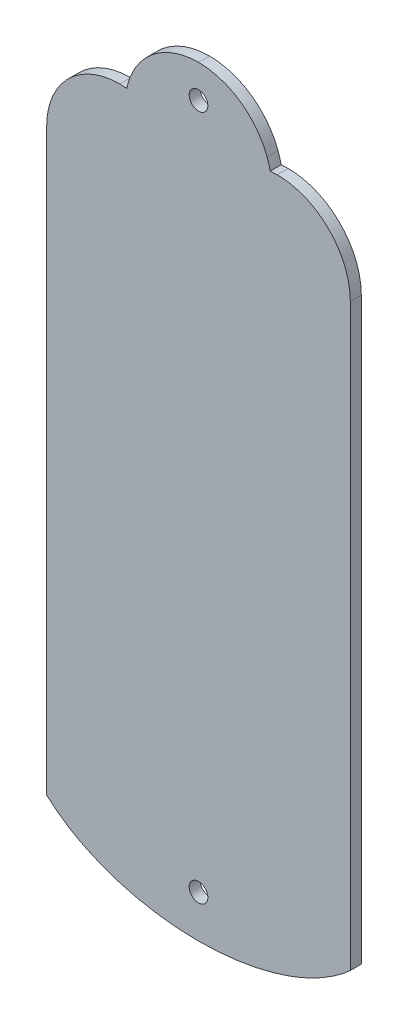
ISO-10303-21;
HEADER;
FILE_DESCRIPTION(('STEP AP214'),'2;1');
FILE_NAME('part.step','',(''),(''),'','','');
FILE_SCHEMA(('AUTOMOTIVE_DESIGN { 1 0 10303 214 1 1 1 1 }'));
ENDSEC;
DATA;
#1=APPLICATION_CONTEXT('core data for automotive mechanical design processes');
#2=APPLICATION_PROTOCOL_DEFINITION('international standard','automotive_design',2000,#1);
#3=PRODUCT_CONTEXT('',#1,'mechanical');
#4=PRODUCT('Part','Part','',(#3));
#5=PRODUCT_RELATED_PRODUCT_CATEGORY('part','',(#4));
#6=PRODUCT_DEFINITION_FORMATION('','',#4);
#7=PRODUCT_DEFINITION_CONTEXT('part definition',#1,'design');
#8=PRODUCT_DEFINITION('design','',#6,#7);
#9=PRODUCT_DEFINITION_SHAPE('','',#8);
#10=(LENGTH_UNIT() NAMED_UNIT(*) SI_UNIT(.MILLI.,.METRE.));
#11=(NAMED_UNIT(*) PLANE_ANGLE_UNIT() SI_UNIT($,.RADIAN.));
#12=(NAMED_UNIT(*) SI_UNIT($,.STERADIAN.) SOLID_ANGLE_UNIT());
#13=UNCERTAINTY_MEASURE_WITH_UNIT(LENGTH_MEASURE(1.E-05),#10,'distance_accuracy_value','');
#14=(GEOMETRIC_REPRESENTATION_CONTEXT(3) GLOBAL_UNCERTAINTY_ASSIGNED_CONTEXT((#13)) GLOBAL_UNIT_ASSIGNED_CONTEXT((#10,
#11,#12)) REPRESENTATION_CONTEXT('',''));
#15=CARTESIAN_POINT('',(0.,0.,0.));
#16=DIRECTION('',(0.,0.,1.));
#17=DIRECTION('',(1.,0.,0.));
#18=AXIS2_PLACEMENT_3D('',#15,#16,#17);
#19=CARTESIAN_POINT('',(35.6433481551177,82.2823295175627,3.));
#20=DIRECTION('',(0.,0.,-1.));
#21=DIRECTION('',(-1.,0.,0.));
#22=AXIS2_PLACEMENT_3D('',#19,#20,#21);
#23=PLANE('',#22);
#24=CARTESIAN_POINT('',(41.5007829350458,68.1407912189944,3.));
#25=CARTESIAN_POINT('',(41.5007829350458,79.1862625771814,3.));
#26=CARTESIAN_POINT('',(32.5472812147364,88.1397642974907,3.));
#27=CARTESIAN_POINT('',(21.5018098565495,88.1397642974907,3.));
#28=B_SPLINE_CURVE_WITH_KNOTS('',3,(#24,#25,#26,#27),.UNSPECIFIED.,.F.,.F.,(4,4),(0.,1.),.UNSPECIFIED.);
#29=CARTESIAN_POINT('',(41.5007829350458,68.1407912189944,3.));
#30=VERTEX_POINT('',#29);
#31=CARTESIAN_POINT('',(21.5018098565495,88.1397642974907,3.));
#32=VERTEX_POINT('',#31);
#33=EDGE_CURVE('E283',#30,#32,#28,.T.);
#34=ORIENTED_EDGE('',*,*,#33,.T.);
#35=CARTESIAN_POINT('',(21.5018098565495,88.1397642974907,3.));
#36=CARTESIAN_POINT('',(20.8597517173328,88.1397642974907,3.));
#37=CARTESIAN_POINT('',(20.2212248009885,88.1080263553329,3.));
#38=CARTESIAN_POINT('',(19.5932700214146,88.0480386301959,3.));
#39=B_SPLINE_CURVE_WITH_KNOTS('',3,(#35,#36,#37,#38),.UNSPECIFIED.,.F.,.F.,(4,4),(1.,2.),.UNSPECIFIED.);
#40=CARTESIAN_POINT('',(19.5932700214146,88.0480386301959,3.));
#41=VERTEX_POINT('',#40);
#42=EDGE_CURVE('E118',#32,#41,#39,.T.);
#43=ORIENTED_EDGE('',*,*,#42,.T.);
#44=CARTESIAN_POINT('',(19.5932700214146,88.0480386301959,3.));
#45=CARTESIAN_POINT('',(19.3886744132843,89.0464057699746,3.));
#46=CARTESIAN_POINT('',(19.1064349656552,90.0200758814933,3.));
#47=CARTESIAN_POINT('',(18.7607196337104,90.9619865190074,3.));
#48=B_SPLINE_CURVE_WITH_KNOTS('',3,(#44,#45,#46,#47),.UNSPECIFIED.,.F.,.F.,(4,4),(2.,3.),.UNSPECIFIED.);
#49=CARTESIAN_POINT('',(18.7607196337104,90.9619865190074,3.));
#50=VERTEX_POINT('',#49);
#51=EDGE_CURVE('E263',#41,#50,#48,.T.);
#52=ORIENTED_EDGE('',*,*,#51,.T.);
#53=CARTESIAN_POINT('',(18.7607196337104,90.9619865190074,3.));
#54=CARTESIAN_POINT('',(15.9384974121937,98.5819994362105,3.));
#55=CARTESIAN_POINT('',(8.60425516549215,104.014764293522,3.));
#56=CARTESIAN_POINT('',(0.,104.014764293522,3.));
#57=B_SPLINE_CURVE_WITH_KNOTS('',3,(#53,#54,#55,#56),.UNSPECIFIED.,.F.,.F.,(4,4),(3.,4.),.UNSPECIFIED.);
#58=CARTESIAN_POINT('',(0.,104.014764293522,3.));
#59=VERTEX_POINT('',#58);
#60=EDGE_CURVE('E255',#50,#59,#57,.T.);
#61=ORIENTED_EDGE('',*,*,#60,.T.);
#62=CARTESIAN_POINT('',(0.,104.014764293522,3.));
#63=CARTESIAN_POINT('',(-8.60425516549218,104.014764293522,3.));
#64=CARTESIAN_POINT('',(-15.9384974121938,98.5819994362105,3.));
#65=CARTESIAN_POINT('',(-18.7607196337104,90.9619865190074,3.));
#66=B_SPLINE_CURVE_WITH_KNOTS('',3,(#62,#63,#64,#65),.UNSPECIFIED.,.F.,.F.,(4,4),(4.,5.),.UNSPECIFIED.);
#67=CARTESIAN_POINT('',(-18.7607196337104,90.9619865190074,3.));
#68=VERTEX_POINT('',#67);
#69=EDGE_CURVE('E247',#59,#68,#66,.T.);
#70=ORIENTED_EDGE('',*,*,#69,.T.);
#71=CARTESIAN_POINT('',(-18.7607196337104,90.9619865190074,3.));
#72=CARTESIAN_POINT('',(-19.106456497502,90.0200758814933,3.));
#73=CARTESIAN_POINT('',(-19.3886744132843,89.0464057699746,3.));
#74=CARTESIAN_POINT('',(-19.5932700214146,88.0480386301959,3.));
#75=B_SPLINE_CURVE_WITH_KNOTS('',3,(#71,#72,#73,#74),.UNSPECIFIED.,.F.,.F.,(4,4),(5.,6.),.UNSPECIFIED.);
#76=CARTESIAN_POINT('',(-19.5932700214146,88.0480386301959,3.));
#77=VERTEX_POINT('',#76);
#78=EDGE_CURVE('E243',#68,#77,#75,.T.);
#79=ORIENTED_EDGE('',*,*,#78,.T.);
#80=CARTESIAN_POINT('',(-19.5932700214146,88.0480386301959,3.));
#81=CARTESIAN_POINT('',(-20.2212248009885,88.1080263553329,3.));
#82=CARTESIAN_POINT('',(-20.8562204944604,88.1397642974907,3.));
#83=CARTESIAN_POINT('',(-21.4982786336771,88.1397642974907,3.));
#84=B_SPLINE_CURVE_WITH_KNOTS('',3,(#80,#81,#82,#83),.UNSPECIFIED.,.F.,.F.,(4,4),(6.,7.),.UNSPECIFIED.);
#85=CARTESIAN_POINT('',(-21.4982786336771,88.1397642974907,3.));
#86=VERTEX_POINT('',#85);
#87=EDGE_CURVE('E218',#77,#86,#84,.T.);
#88=ORIENTED_EDGE('',*,*,#87,.T.);
#89=CARTESIAN_POINT('',(-21.4982786336771,88.1397642974907,3.));
#90=CARTESIAN_POINT('',(-32.5472812147365,88.1397642974907,3.));
#91=CARTESIAN_POINT('',(-41.5007829350458,79.1862625771814,3.));
#92=CARTESIAN_POINT('',(-41.5007829350458,68.1407912189944,3.));
#93=B_SPLINE_CURVE_WITH_KNOTS('',3,(#89,#90,#91,#92),.UNSPECIFIED.,.F.,.F.,(4,4),(7.,8.),.UNSPECIFIED.);
#94=CARTESIAN_POINT('',(-41.5007829350458,68.1407912189944,3.));
#95=VERTEX_POINT('',#94);
#96=EDGE_CURVE('E213',#86,#95,#93,.T.);
#97=ORIENTED_EDGE('',*,*,#96,.T.);
#98=DIRECTION('',(0.,-1.,0.));
#99=VECTOR('',#98,1.);
#100=CARTESIAN_POINT('',(-41.5007829350458,68.1407912189944,3.));
#101=LINE('',#100,#99);
#102=CARTESIAN_POINT('',(-41.5007829350458,-90.2458372950111,3.));
#103=VERTEX_POINT('',#102);
#104=EDGE_CURVE('E208',#95,#103,#101,.T.);
#105=ORIENTED_EDGE('',*,*,#104,.T.);
#106=CARTESIAN_POINT('',(-41.5007829350458,-90.2458372950111,3.));
#107=CARTESIAN_POINT('',(-38.3892803520021,-93.0892253219153,3.));
#108=CARTESIAN_POINT('',(-34.5686909907068,-95.5939604626194,3.));
#109=CARTESIAN_POINT('',(-30.1977691574896,-97.6647642951095,3.));
#110=B_SPLINE_CURVE_WITH_KNOTS('',3,(#106,#107,#108,#109),.UNSPECIFIED.,.F.,.F.,(4,4),(11.,12.),.UNSPECIFIED.);
#111=CARTESIAN_POINT('',(-30.1977691574896,-97.6647642951095,3.));
#112=VERTEX_POINT('',#111);
#113=EDGE_CURVE('E200',#103,#112,#110,.T.);
#114=ORIENTED_EDGE('',*,*,#113,.T.);
#115=CARTESIAN_POINT('',(-30.1977691574896,-97.6647642951095,3.));
#116=CARTESIAN_POINT('',(-21.7804965494594,-101.654680099505,3.));
#117=CARTESIAN_POINT('',(-11.3241580510969,-104.014764293522,3.));
#118=CARTESIAN_POINT('',(0.,-104.014764293522,3.));
#119=B_SPLINE_CURVE_WITH_KNOTS('',3,(#115,#116,#117,#118),.UNSPECIFIED.,.F.,.F.,(4,4),(12.,13.),.UNSPECIFIED.);
#120=CARTESIAN_POINT('',(0.,-104.014764293522,3.));
#121=VERTEX_POINT('',#120);
#122=EDGE_CURVE('E155',#112,#121,#119,.T.);
#123=ORIENTED_EDGE('',*,*,#122,.T.);
#124=CARTESIAN_POINT('',(0.,-104.014764293522,3.));
#125=CARTESIAN_POINT('',(11.3241580510969,-104.014764293522,3.));
#126=CARTESIAN_POINT('',(21.7804965494594,-101.654680099505,3.));
#127=CARTESIAN_POINT('',(30.1977691574896,-97.6647642951095,3.));
#128=B_SPLINE_CURVE_WITH_KNOTS('',3,(#124,#125,#126,#127),.UNSPECIFIED.,.F.,.F.,(4,4),(13.,14.),.UNSPECIFIED.);
#129=CARTESIAN_POINT('',(30.1977691574896,-97.6647642951095,3.));
#130=VERTEX_POINT('',#129);
#131=EDGE_CURVE('E149',#121,#130,#128,.T.);
#132=ORIENTED_EDGE('',*,*,#131,.T.);
#133=CARTESIAN_POINT('',(30.1977691574896,-97.6647642951095,3.));
#134=CARTESIAN_POINT('',(34.5686909907068,-95.5939604626194,3.));
#135=CARTESIAN_POINT('',(38.3892803520021,-93.0892253219153,3.));
#136=CARTESIAN_POINT('',(41.5007829350458,-90.2458372950111,3.));
#137=B_SPLINE_CURVE_WITH_KNOTS('',3,(#133,#134,#135,#136),.UNSPECIFIED.,.F.,.F.,(4,4),(14.,15.),.UNSPECIFIED.);
#138=CARTESIAN_POINT('',(41.5007829350458,-90.2458372950111,3.));
#139=VERTEX_POINT('',#138);
#140=EDGE_CURVE('E153',#130,#139,#137,.T.);
#141=ORIENTED_EDGE('',*,*,#140,.T.);
#142=DIRECTION('',(0.,1.,0.));
#143=VECTOR('',#142,1.);
#144=CARTESIAN_POINT('',(41.5007829350458,68.1407912189944,3.));
#145=LINE('',#144,#143);
#146=EDGE_CURVE('E57',#139,#30,#145,.T.);
#147=ORIENTED_EDGE('',*,*,#146,.T.);
#148=EDGE_LOOP('',(#34,#43,#52,#61,#70,#79,#88,#97,#105,#114,#123,#132,#141,#147));
#149=FACE_BOUND('',#148,.T.);
#150=CARTESIAN_POINT('',(0.,95.,3.));
#151=DIRECTION('',(0.,0.,1.));
#152=DIRECTION('',(1.,0.,0.));
#153=AXIS2_PLACEMENT_3D('',#150,#151,#152);
#154=CIRCLE('',#153,2.55);
#155=CARTESIAN_POINT('',(2.55,95.,3.));
#156=VERTEX_POINT('',#155);
#157=EDGE_CURVE('E297',#156,#156,#154,.T.);
#158=ORIENTED_EDGE('',*,*,#157,.F.);
#159=EDGE_LOOP('',(#158));
#160=FACE_BOUND('',#159,.T.);
#161=CARTESIAN_POINT('',(0.,-92.443657491673,3.));
#162=DIRECTION('',(0.,0.,1.));
#163=DIRECTION('',(1.,0.,0.));
#164=AXIS2_PLACEMENT_3D('',#161,#162,#163);
#165=CIRCLE('',#164,2.55);
#166=CARTESIAN_POINT('',(2.55,-92.443657491673,3.));
#167=VERTEX_POINT('',#166);
#168=EDGE_CURVE('E298',#167,#167,#165,.T.);
#169=ORIENTED_EDGE('',*,*,#168,.F.);
#170=EDGE_LOOP('',(#169));
#171=FACE_BOUND('',#170,.T.);
#172=ADVANCED_FACE('F39',(#149,#160,#171),#23,.F.);
#173=CARTESIAN_POINT('',(35.6433481551177,82.2823295175627,0.));
#174=DIRECTION('',(0.,0.,-1.));
#175=DIRECTION('',(-1.,0.,0.));
#176=AXIS2_PLACEMENT_3D('',#173,#174,#175);
#177=PLANE('',#176);
#178=CARTESIAN_POINT('',(0.,95.,0.));
#179=DIRECTION('',(0.,0.,1.));
#180=DIRECTION('',(1.,0.,0.));
#181=AXIS2_PLACEMENT_3D('',#178,#179,#180);
#182=CIRCLE('',#181,2.55);
#183=CARTESIAN_POINT('',(2.55,95.,0.));
#184=VERTEX_POINT('',#183);
#185=EDGE_CURVE('E291',#184,#184,#182,.T.);
#186=ORIENTED_EDGE('',*,*,#185,.T.);
#187=EDGE_LOOP('',(#186));
#188=FACE_BOUND('',#187,.T.);
#189=CARTESIAN_POINT('',(41.5007829350458,68.1407912189944,0.));
#190=CARTESIAN_POINT('',(41.5007829350458,79.1862625771814,0.));
#191=CARTESIAN_POINT('',(32.5472812147364,88.1397642974907,0.));
#192=CARTESIAN_POINT('',(21.5018098565495,88.1397642974907,0.));
#193=B_SPLINE_CURVE_WITH_KNOTS('',3,(#189,#190,#191,#192),.UNSPECIFIED.,.F.,.F.,(4,4),(0.,1.),.UNSPECIFIED.);
#194=CARTESIAN_POINT('',(41.5007829350458,68.1407912189944,0.));
#195=VERTEX_POINT('',#194);
#196=CARTESIAN_POINT('',(21.5018098565495,88.1397642974907,0.));
#197=VERTEX_POINT('',#196);
#198=EDGE_CURVE('E301',#195,#197,#193,.T.);
#199=ORIENTED_EDGE('',*,*,#198,.F.);
#200=DIRECTION('',(0.,1.,0.));
#201=VECTOR('',#200,1.);
#202=CARTESIAN_POINT('',(41.5007829350458,68.1407912189944,0.));
#203=LINE('',#202,#201);
#204=CARTESIAN_POINT('',(41.5007829350458,-90.2458372950111,0.));
#205=VERTEX_POINT('',#204);
#206=EDGE_CURVE('E110',#205,#195,#203,.T.);
#207=ORIENTED_EDGE('',*,*,#206,.F.);
#208=CARTESIAN_POINT('',(30.1977691574896,-97.6647642951095,0.));
#209=CARTESIAN_POINT('',(34.5686909907068,-95.5939604626194,0.));
#210=CARTESIAN_POINT('',(38.3892803520021,-93.0892253219153,0.));
#211=CARTESIAN_POINT('',(41.5007829350458,-90.2458372950111,0.));
#212=B_SPLINE_CURVE_WITH_KNOTS('',3,(#208,#209,#210,#211),.UNSPECIFIED.,.F.,.F.,(4,4),(14.,15.),.UNSPECIFIED.);
#213=CARTESIAN_POINT('',(30.1977691574896,-97.6647642951095,0.));
#214=VERTEX_POINT('',#213);
#215=EDGE_CURVE('E104',#214,#205,#212,.T.);
#216=ORIENTED_EDGE('',*,*,#215,.F.);
#217=CARTESIAN_POINT('',(0.,-104.014764293522,0.));
#218=CARTESIAN_POINT('',(11.3241580510969,-104.014764293522,0.));
#219=CARTESIAN_POINT('',(21.7804965494594,-101.654680099505,0.));
#220=CARTESIAN_POINT('',(30.1977691574896,-97.6647642951095,0.));
#221=B_SPLINE_CURVE_WITH_KNOTS('',3,(#217,#218,#219,#220),.UNSPECIFIED.,.F.,.F.,(4,4),(13.,14.),.UNSPECIFIED.);
#222=CARTESIAN_POINT('',(0.,-104.014764293522,0.));
#223=VERTEX_POINT('',#222);
#224=EDGE_CURVE('E163',#223,#214,#221,.T.);
#225=ORIENTED_EDGE('',*,*,#224,.F.);
#226=CARTESIAN_POINT('',(-30.1977691574896,-97.6647642951095,0.));
#227=CARTESIAN_POINT('',(-21.7804965494594,-101.654680099505,0.));
#228=CARTESIAN_POINT('',(-11.3241580510969,-104.014764293522,0.));
#229=CARTESIAN_POINT('',(0.,-104.014764293522,0.));
#230=B_SPLINE_CURVE_WITH_KNOTS('',3,(#226,#227,#228,#229),.UNSPECIFIED.,.F.,.F.,(4,4),(12.,13.),.UNSPECIFIED.);
#231=CARTESIAN_POINT('',(-30.1977691574896,-97.6647642951095,0.));
#232=VERTEX_POINT('',#231);
#233=EDGE_CURVE('E541',#232,#223,#230,.T.);
#234=ORIENTED_EDGE('',*,*,#233,.F.);
#235=CARTESIAN_POINT('',(-41.5007829350458,-90.2458372950111,0.));
#236=CARTESIAN_POINT('',(-38.3892803520021,-93.0892253219153,0.));
#237=CARTESIAN_POINT('',(-34.5686909907068,-95.5939604626194,0.));
#238=CARTESIAN_POINT('',(-30.1977691574896,-97.6647642951095,0.));
#239=B_SPLINE_CURVE_WITH_KNOTS('',3,(#235,#236,#237,#238),.UNSPECIFIED.,.F.,.F.,(4,4),(11.,12.),.UNSPECIFIED.);
#240=CARTESIAN_POINT('',(-41.5007829350458,-90.2458372950111,0.));
#241=VERTEX_POINT('',#240);
#242=EDGE_CURVE('E537',#241,#232,#239,.T.);
#243=ORIENTED_EDGE('',*,*,#242,.F.);
#244=DIRECTION('',(0.,-1.,0.));
#245=VECTOR('',#244,1.);
#246=CARTESIAN_POINT('',(-41.5007829350458,68.1407912189944,0.));
#247=LINE('',#246,#245);
#248=CARTESIAN_POINT('',(-41.5007829350458,68.1407912189944,0.));
#249=VERTEX_POINT('',#248);
#250=EDGE_CURVE('E532',#249,#241,#247,.T.);
#251=ORIENTED_EDGE('',*,*,#250,.F.);
#252=CARTESIAN_POINT('',(-21.4982786336771,88.1397642974907,0.));
#253=CARTESIAN_POINT('',(-32.5472812147365,88.1397642974907,0.));
#254=CARTESIAN_POINT('',(-41.5007829350458,79.1862625771814,0.));
#255=CARTESIAN_POINT('',(-41.5007829350458,68.1407912189944,0.));
#256=B_SPLINE_CURVE_WITH_KNOTS('',3,(#252,#253,#254,#255),.UNSPECIFIED.,.F.,.F.,(4,4),(7.,8.),.UNSPECIFIED.);
#257=CARTESIAN_POINT('',(-21.4982786336771,88.1397642974907,0.));
#258=VERTEX_POINT('',#257);
#259=EDGE_CURVE('E525',#258,#249,#256,.T.);
#260=ORIENTED_EDGE('',*,*,#259,.F.);
#261=CARTESIAN_POINT('',(-19.5932700214146,88.0480386301959,0.));
#262=CARTESIAN_POINT('',(-20.2212248009885,88.1080263553329,0.));
#263=CARTESIAN_POINT('',(-20.8562204944604,88.1397642974907,0.));
#264=CARTESIAN_POINT('',(-21.4982786336771,88.1397642974907,0.));
#265=B_SPLINE_CURVE_WITH_KNOTS('',3,(#261,#262,#263,#264),.UNSPECIFIED.,.F.,.F.,(4,4),(6.,7.),.UNSPECIFIED.);
#266=CARTESIAN_POINT('',(-19.5932700214146,88.0480386301959,0.));
#267=VERTEX_POINT('',#266);
#268=EDGE_CURVE('E518',#267,#258,#265,.T.);
#269=ORIENTED_EDGE('',*,*,#268,.F.);
#270=CARTESIAN_POINT('',(-18.7607196337104,90.9619865190074,0.));
#271=CARTESIAN_POINT('',(-19.106456497502,90.0200758814933,0.));
#272=CARTESIAN_POINT('',(-19.3886744132843,89.0464057699746,0.));
#273=CARTESIAN_POINT('',(-19.5932700214146,88.0480386301959,0.));
#274=B_SPLINE_CURVE_WITH_KNOTS('',3,(#270,#271,#272,#273),.UNSPECIFIED.,.F.,.F.,(4,4),(5.,6.),.UNSPECIFIED.);
#275=CARTESIAN_POINT('',(-18.7607196337104,90.9619865190074,0.));
#276=VERTEX_POINT('',#275);
#277=EDGE_CURVE('E511',#276,#267,#274,.T.);
#278=ORIENTED_EDGE('',*,*,#277,.F.);
#279=CARTESIAN_POINT('',(0.,104.014764293522,0.));
#280=CARTESIAN_POINT('',(-8.60425516549218,104.014764293522,0.));
#281=CARTESIAN_POINT('',(-15.9384974121938,98.5819994362105,0.));
#282=CARTESIAN_POINT('',(-18.7607196337104,90.9619865190074,0.));
#283=B_SPLINE_CURVE_WITH_KNOTS('',3,(#279,#280,#281,#282),.UNSPECIFIED.,.F.,.F.,(4,4),(4.,5.),.UNSPECIFIED.);
#284=CARTESIAN_POINT('',(0.,104.014764293522,0.));
#285=VERTEX_POINT('',#284);
#286=EDGE_CURVE('E504',#285,#276,#283,.T.);
#287=ORIENTED_EDGE('',*,*,#286,.F.);
#288=CARTESIAN_POINT('',(18.7607196337104,90.9619865190074,0.));
#289=CARTESIAN_POINT('',(15.9384974121937,98.5819994362105,0.));
#290=CARTESIAN_POINT('',(8.60425516549215,104.014764293522,0.));
#291=CARTESIAN_POINT('',(0.,104.014764293522,0.));
#292=B_SPLINE_CURVE_WITH_KNOTS('',3,(#288,#289,#290,#291),.UNSPECIFIED.,.F.,.F.,(4,4),(3.,4.),.UNSPECIFIED.);
#293=CARTESIAN_POINT('',(18.7607196337104,90.9619865190074,0.));
#294=VERTEX_POINT('',#293);
#295=EDGE_CURVE('E497',#294,#285,#292,.T.);
#296=ORIENTED_EDGE('',*,*,#295,.F.);
#297=CARTESIAN_POINT('',(19.5932700214146,88.0480386301959,0.));
#298=CARTESIAN_POINT('',(19.3886744132843,89.0464057699746,0.));
#299=CARTESIAN_POINT('',(19.1064349656552,90.0200758814933,0.));
#300=CARTESIAN_POINT('',(18.7607196337104,90.9619865190074,0.));
#301=B_SPLINE_CURVE_WITH_KNOTS('',3,(#297,#298,#299,#300),.UNSPECIFIED.,.F.,.F.,(4,4),(2.,3.),.UNSPECIFIED.);
#302=CARTESIAN_POINT('',(19.5932700214146,88.0480386301959,0.));
#303=VERTEX_POINT('',#302);
#304=EDGE_CURVE('E481',#303,#294,#301,.T.);
#305=ORIENTED_EDGE('',*,*,#304,.F.);
#306=CARTESIAN_POINT('',(21.5018098565495,88.1397642974907,0.));
#307=CARTESIAN_POINT('',(20.8597517173328,88.1397642974907,0.));
#308=CARTESIAN_POINT('',(20.2212248009885,88.1080263553329,0.));
#309=CARTESIAN_POINT('',(19.5932700214146,88.0480386301959,0.));
#310=B_SPLINE_CURVE_WITH_KNOTS('',3,(#306,#307,#308,#309),.UNSPECIFIED.,.F.,.F.,(4,4),(1.,2.),.UNSPECIFIED.);
#311=EDGE_CURVE('E480',#197,#303,#310,.T.);
#312=ORIENTED_EDGE('',*,*,#311,.F.);
#313=EDGE_LOOP('',(#199,#207,#216,#225,#234,#243,#251,#260,#269,#278,#287,#296,#305,#312));
#314=FACE_BOUND('',#313,.T.);
#315=CARTESIAN_POINT('',(0.,-92.443657491673,0.));
#316=DIRECTION('',(0.,0.,1.));
#317=DIRECTION('',(1.,0.,0.));
#318=AXIS2_PLACEMENT_3D('',#315,#316,#317);
#319=CIRCLE('',#318,2.55);
#320=CARTESIAN_POINT('',(2.55,-92.443657491673,0.));
#321=VERTEX_POINT('',#320);
#322=EDGE_CURVE('E302',#321,#321,#319,.T.);
#323=ORIENTED_EDGE('',*,*,#322,.T.);
#324=EDGE_LOOP('',(#323));
#325=FACE_BOUND('',#324,.T.);
#326=ADVANCED_FACE('F312',(#188,#314,#325),#177,.T.);
#327=DIRECTION('',(0.,0.,-1.));
#328=VECTOR('',#327,1.);
#329=SURFACE_OF_LINEAR_EXTRUSION('',#28,#328);
#330=ORIENTED_EDGE('',*,*,#198,.T.);
#331=DIRECTION('',(0.,0.,-1.));
#332=VECTOR('',#331,1.);
#333=CARTESIAN_POINT('',(21.5018098565495,88.1397642974907,3.));
#334=LINE('',#333,#332);
#335=EDGE_CURVE('E11',#32,#197,#334,.T.);
#336=ORIENTED_EDGE('',*,*,#335,.F.);
#337=ORIENTED_EDGE('',*,*,#33,.F.);
#338=DIRECTION('',(0.,0.,-1.));
#339=VECTOR('',#338,1.);
#340=CARTESIAN_POINT('',(41.5007829350458,68.1407912189944,3.));
#341=LINE('',#340,#339);
#342=EDGE_CURVE('E169',#30,#195,#341,.T.);
#343=ORIENTED_EDGE('',*,*,#342,.T.);
#344=EDGE_LOOP('',(#330,#336,#337,#343));
#345=FACE_BOUND('',#344,.T.);
#346=ADVANCED_FACE('F41',(#345),#329,.F.);
#347=DIRECTION('',(0.,0.,-1.));
#348=VECTOR('',#347,1.);
#349=SURFACE_OF_LINEAR_EXTRUSION('',#39,#348);
#350=ORIENTED_EDGE('',*,*,#311,.T.);
#351=DIRECTION('',(0.,0.,-1.));
#352=VECTOR('',#351,1.);
#353=CARTESIAN_POINT('',(19.5932700214146,88.0480386301959,3.));
#354=LINE('',#353,#352);
#355=EDGE_CURVE('E49',#41,#303,#354,.T.);
#356=ORIENTED_EDGE('',*,*,#355,.F.);
#357=ORIENTED_EDGE('',*,*,#42,.F.);
#358=ORIENTED_EDGE('',*,*,#335,.T.);
#359=EDGE_LOOP('',(#350,#356,#357,#358));
#360=FACE_BOUND('',#359,.T.);
#361=ADVANCED_FACE('F277',(#360),#349,.F.);
#362=DIRECTION('',(0.,0.,-1.));
#363=VECTOR('',#362,1.);
#364=SURFACE_OF_LINEAR_EXTRUSION('',#48,#363);
#365=ORIENTED_EDGE('',*,*,#304,.T.);
#366=DIRECTION('',(0.,0.,-1.));
#367=VECTOR('',#366,1.);
#368=CARTESIAN_POINT('',(18.7607196337104,90.9619865190074,3.));
#369=LINE('',#368,#367);
#370=EDGE_CURVE('E588',#50,#294,#369,.T.);
#371=ORIENTED_EDGE('',*,*,#370,.F.);
#372=ORIENTED_EDGE('',*,*,#51,.F.);
#373=ORIENTED_EDGE('',*,*,#355,.T.);
#374=EDGE_LOOP('',(#365,#371,#372,#373));
#375=FACE_BOUND('',#374,.T.);
#376=ADVANCED_FACE('F274',(#375),#364,.F.);
#377=DIRECTION('',(0.,0.,-1.));
#378=VECTOR('',#377,1.);
#379=SURFACE_OF_LINEAR_EXTRUSION('',#57,#378);
#380=ORIENTED_EDGE('',*,*,#295,.T.);
#381=DIRECTION('',(0.,0.,-1.));
#382=VECTOR('',#381,1.);
#383=CARTESIAN_POINT('',(0.,104.014764293522,3.));
#384=LINE('',#383,#382);
#385=EDGE_CURVE('E585',#59,#285,#384,.T.);
#386=ORIENTED_EDGE('',*,*,#385,.F.);
#387=ORIENTED_EDGE('',*,*,#60,.F.);
#388=ORIENTED_EDGE('',*,*,#370,.T.);
#389=EDGE_LOOP('',(#380,#386,#387,#388));
#390=FACE_BOUND('',#389,.T.);
#391=ADVANCED_FACE('F271',(#390),#379,.F.);
#392=DIRECTION('',(0.,0.,-1.));
#393=VECTOR('',#392,1.);
#394=SURFACE_OF_LINEAR_EXTRUSION('',#66,#393);
#395=ORIENTED_EDGE('',*,*,#286,.T.);
#396=DIRECTION('',(0.,0.,-1.));
#397=VECTOR('',#396,1.);
#398=CARTESIAN_POINT('',(-18.7607196337104,90.9619865190074,3.));
#399=LINE('',#398,#397);
#400=EDGE_CURVE('E582',#68,#276,#399,.T.);
#401=ORIENTED_EDGE('',*,*,#400,.F.);
#402=ORIENTED_EDGE('',*,*,#69,.F.);
#403=ORIENTED_EDGE('',*,*,#385,.T.);
#404=EDGE_LOOP('',(#395,#401,#402,#403));
#405=FACE_BOUND('',#404,.T.);
#406=ADVANCED_FACE('F239',(#405),#394,.F.);
#407=DIRECTION('',(0.,0.,-1.));
#408=VECTOR('',#407,1.);
#409=SURFACE_OF_LINEAR_EXTRUSION('',#75,#408);
#410=ORIENTED_EDGE('',*,*,#277,.T.);
#411=DIRECTION('',(0.,0.,-1.));
#412=VECTOR('',#411,1.);
#413=CARTESIAN_POINT('',(-19.5932700214146,88.0480386301959,3.));
#414=LINE('',#413,#412);
#415=EDGE_CURVE('E579',#77,#267,#414,.T.);
#416=ORIENTED_EDGE('',*,*,#415,.F.);
#417=ORIENTED_EDGE('',*,*,#78,.F.);
#418=ORIENTED_EDGE('',*,*,#400,.T.);
#419=EDGE_LOOP('',(#410,#416,#417,#418));
#420=FACE_BOUND('',#419,.T.);
#421=ADVANCED_FACE('F235',(#420),#409,.F.);
#422=DIRECTION('',(0.,0.,-1.));
#423=VECTOR('',#422,1.);
#424=SURFACE_OF_LINEAR_EXTRUSION('',#84,#423);
#425=ORIENTED_EDGE('',*,*,#268,.T.);
#426=DIRECTION('',(0.,0.,-1.));
#427=VECTOR('',#426,1.);
#428=CARTESIAN_POINT('',(-21.4982786336771,88.1397642974907,3.));
#429=LINE('',#428,#427);
#430=EDGE_CURVE('E576',#86,#258,#429,.T.);
#431=ORIENTED_EDGE('',*,*,#430,.F.);
#432=ORIENTED_EDGE('',*,*,#87,.F.);
#433=ORIENTED_EDGE('',*,*,#415,.T.);
#434=EDGE_LOOP('',(#425,#431,#432,#433));
#435=FACE_BOUND('',#434,.T.);
#436=ADVANCED_FACE('F231',(#435),#424,.F.);
#437=DIRECTION('',(0.,0.,-1.));
#438=VECTOR('',#437,1.);
#439=SURFACE_OF_LINEAR_EXTRUSION('',#93,#438);
#440=ORIENTED_EDGE('',*,*,#259,.T.);
#441=DIRECTION('',(0.,0.,-1.));
#442=VECTOR('',#441,1.);
#443=CARTESIAN_POINT('',(-41.5007829350458,68.1407912189944,3.));
#444=LINE('',#443,#442);
#445=EDGE_CURVE('E573',#95,#249,#444,.T.);
#446=ORIENTED_EDGE('',*,*,#445,.F.);
#447=ORIENTED_EDGE('',*,*,#96,.F.);
#448=ORIENTED_EDGE('',*,*,#430,.T.);
#449=EDGE_LOOP('',(#440,#446,#447,#448));
#450=FACE_BOUND('',#449,.T.);
#451=ADVANCED_FACE('F227',(#450),#439,.F.);
#452=CARTESIAN_POINT('',(-41.5007829350458,68.1407912189944,3.));
#453=DIRECTION('',(1.,0.,0.));
#454=DIRECTION('',(0.,0.,-1.));
#455=AXIS2_PLACEMENT_3D('',#452,#453,#454);
#456=PLANE('',#455);
#457=ORIENTED_EDGE('',*,*,#250,.T.);
#458=DIRECTION('',(0.,0.,-1.));
#459=VECTOR('',#458,1.);
#460=CARTESIAN_POINT('',(-41.5007829350458,-90.2458372950111,3.));
#461=LINE('',#460,#459);
#462=EDGE_CURVE('E570',#103,#241,#461,.T.);
#463=ORIENTED_EDGE('',*,*,#462,.F.);
#464=ORIENTED_EDGE('',*,*,#104,.F.);
#465=ORIENTED_EDGE('',*,*,#445,.T.);
#466=EDGE_LOOP('',(#457,#463,#464,#465));
#467=FACE_BOUND('',#466,.T.);
#468=ADVANCED_FACE('F230',(#467),#456,.F.);
#469=DIRECTION('',(0.,0.,-1.));
#470=VECTOR('',#469,1.);
#471=SURFACE_OF_LINEAR_EXTRUSION('',#110,#470);
#472=ORIENTED_EDGE('',*,*,#242,.T.);
#473=DIRECTION('',(0.,0.,-1.));
#474=VECTOR('',#473,1.);
#475=CARTESIAN_POINT('',(-30.1977691574896,-97.6647642951095,3.));
#476=LINE('',#475,#474);
#477=EDGE_CURVE('E567',#112,#232,#476,.T.);
#478=ORIENTED_EDGE('',*,*,#477,.F.);
#479=ORIENTED_EDGE('',*,*,#113,.F.);
#480=ORIENTED_EDGE('',*,*,#462,.T.);
#481=EDGE_LOOP('',(#472,#478,#479,#480));
#482=FACE_BOUND('',#481,.T.);
#483=ADVANCED_FACE('F193',(#482),#471,.F.);
#484=DIRECTION('',(0.,0.,-1.));
#485=VECTOR('',#484,1.);
#486=SURFACE_OF_LINEAR_EXTRUSION('',#119,#485);
#487=ORIENTED_EDGE('',*,*,#233,.T.);
#488=DIRECTION('',(0.,0.,-1.));
#489=VECTOR('',#488,1.);
#490=CARTESIAN_POINT('',(0.,-104.014764293522,3.));
#491=LINE('',#490,#489);
#492=EDGE_CURVE('E164',#121,#223,#491,.T.);
#493=ORIENTED_EDGE('',*,*,#492,.F.);
#494=ORIENTED_EDGE('',*,*,#122,.F.);
#495=ORIENTED_EDGE('',*,*,#477,.T.);
#496=EDGE_LOOP('',(#487,#493,#494,#495));
#497=FACE_BOUND('',#496,.T.);
#498=ADVANCED_FACE('F190',(#497),#486,.F.);
#499=DIRECTION('',(0.,0.,-1.));
#500=VECTOR('',#499,1.);
#501=SURFACE_OF_LINEAR_EXTRUSION('',#128,#500);
#502=ORIENTED_EDGE('',*,*,#224,.T.);
#503=DIRECTION('',(0.,0.,-1.));
#504=VECTOR('',#503,1.);
#505=CARTESIAN_POINT('',(30.1977691574896,-97.6647642951095,3.));
#506=LINE('',#505,#504);
#507=EDGE_CURVE('E160',#130,#214,#506,.T.);
#508=ORIENTED_EDGE('',*,*,#507,.F.);
#509=ORIENTED_EDGE('',*,*,#131,.F.);
#510=ORIENTED_EDGE('',*,*,#492,.T.);
#511=EDGE_LOOP('',(#502,#508,#509,#510));
#512=FACE_BOUND('',#511,.T.);
#513=ADVANCED_FACE('F161',(#512),#501,.F.);
#514=DIRECTION('',(0.,0.,-1.));
#515=VECTOR('',#514,1.);
#516=SURFACE_OF_LINEAR_EXTRUSION('',#137,#515);
#517=ORIENTED_EDGE('',*,*,#215,.T.);
#518=DIRECTION('',(0.,0.,-1.));
#519=VECTOR('',#518,1.);
#520=CARTESIAN_POINT('',(41.5007829350458,-90.2458372950111,3.));
#521=LINE('',#520,#519);
#522=EDGE_CURVE('E165',#139,#205,#521,.T.);
#523=ORIENTED_EDGE('',*,*,#522,.F.);
#524=ORIENTED_EDGE('',*,*,#140,.F.);
#525=ORIENTED_EDGE('',*,*,#507,.T.);
#526=EDGE_LOOP('',(#517,#523,#524,#525));
#527=FACE_BOUND('',#526,.T.);
#528=ADVANCED_FACE('F167',(#527),#516,.F.);
#529=CARTESIAN_POINT('',(41.5007829350458,68.1407912189944,3.));
#530=DIRECTION('',(-1.,0.,0.));
#531=DIRECTION('',(0.,0.,1.));
#532=AXIS2_PLACEMENT_3D('',#529,#530,#531);
#533=PLANE('',#532);
#534=ORIENTED_EDGE('',*,*,#206,.T.);
#535=ORIENTED_EDGE('',*,*,#342,.F.);
#536=ORIENTED_EDGE('',*,*,#146,.F.);
#537=ORIENTED_EDGE('',*,*,#522,.T.);
#538=EDGE_LOOP('',(#534,#535,#536,#537));
#539=FACE_BOUND('',#538,.T.);
#540=ADVANCED_FACE('F186',(#539),#533,.F.);
#541=CARTESIAN_POINT('',(0.,95.,3.));
#542=DIRECTION('',(0.,0.,-1.));
#543=DIRECTION('',(-1.,0.,0.));
#544=AXIS2_PLACEMENT_3D('',#541,#542,#543);
#545=CYLINDRICAL_SURFACE('',#544,2.55);
#546=ORIENTED_EDGE('',*,*,#157,.T.);
#547=EDGE_LOOP('',(#546));
#548=FACE_BOUND('',#547,.T.);
#549=ORIENTED_EDGE('',*,*,#185,.F.);
#550=EDGE_LOOP('',(#549));
#551=FACE_BOUND('',#550,.T.);
#552=ADVANCED_FACE('F319',(#548,#551),#545,.F.);
#553=CARTESIAN_POINT('',(0.,-92.443657491673,3.));
#554=DIRECTION('',(0.,0.,-1.));
#555=DIRECTION('',(-1.,0.,0.));
#556=AXIS2_PLACEMENT_3D('',#553,#554,#555);
#557=CYLINDRICAL_SURFACE('',#556,2.55);
#558=ORIENTED_EDGE('',*,*,#168,.T.);
#559=EDGE_LOOP('',(#558));
#560=FACE_BOUND('',#559,.T.);
#561=ORIENTED_EDGE('',*,*,#322,.F.);
#562=EDGE_LOOP('',(#561));
#563=FACE_BOUND('',#562,.T.);
#564=ADVANCED_FACE('F308',(#560,#563),#557,.F.);
#565=CLOSED_SHELL('',(#172,#326,#346,#361,#376,#391,#406,#421,#436,#451,#468,#483,#498,#513,
#528,#540,#552,#564));
#566=MANIFOLD_SOLID_BREP('B2',#565);
#567=ADVANCED_BREP_SHAPE_REPRESENTATION('',(#18,#566),#14);
#568=SHAPE_DEFINITION_REPRESENTATION(#9,#567);
ENDSEC;
END-ISO-10303-21;
